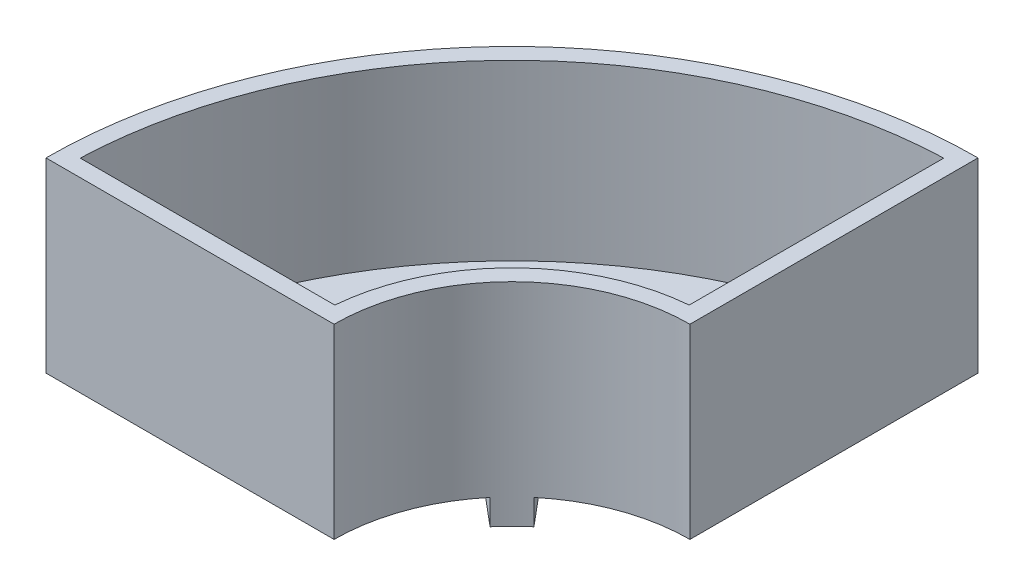
ISO-10303-21;
HEADER;
FILE_DESCRIPTION(('STEP AP214'),'2;1');
FILE_NAME('part.step','',(''),(''),'','','');
FILE_SCHEMA(('AUTOMOTIVE_DESIGN { 1 0 10303 214 1 1 1 1 }'));
ENDSEC;
DATA;
#1=APPLICATION_CONTEXT('core data for automotive mechanical design processes');
#2=APPLICATION_PROTOCOL_DEFINITION('international standard','automotive_design',2000,#1);
#3=PRODUCT_CONTEXT('',#1,'mechanical');
#4=PRODUCT('Part','Part','',(#3));
#5=PRODUCT_RELATED_PRODUCT_CATEGORY('part','',(#4));
#6=PRODUCT_DEFINITION_FORMATION('','',#4);
#7=PRODUCT_DEFINITION_CONTEXT('part definition',#1,'design');
#8=PRODUCT_DEFINITION('design','',#6,#7);
#9=PRODUCT_DEFINITION_SHAPE('','',#8);
#10=(LENGTH_UNIT() NAMED_UNIT(*) SI_UNIT(.MILLI.,.METRE.));
#11=(NAMED_UNIT(*) PLANE_ANGLE_UNIT() SI_UNIT($,.RADIAN.));
#12=(NAMED_UNIT(*) SI_UNIT($,.STERADIAN.) SOLID_ANGLE_UNIT());
#13=UNCERTAINTY_MEASURE_WITH_UNIT(LENGTH_MEASURE(1.E-05),#10,'distance_accuracy_value','');
#14=(GEOMETRIC_REPRESENTATION_CONTEXT(3) GLOBAL_UNCERTAINTY_ASSIGNED_CONTEXT((#13)) GLOBAL_UNIT_ASSIGNED_CONTEXT((#10,
#11,#12)) REPRESENTATION_CONTEXT('',''));
#15=CARTESIAN_POINT('',(0.,0.,0.));
#16=DIRECTION('',(0.,0.,1.));
#17=DIRECTION('',(1.,0.,0.));
#18=AXIS2_PLACEMENT_3D('',#15,#16,#17);
#19=CARTESIAN_POINT('',(0.,0.,0.));
#20=DIRECTION('',(0.,1.,0.));
#21=DIRECTION('',(0.,0.,1.));
#22=AXIS2_PLACEMENT_3D('',#19,#20,#21);
#23=PLANE('',#22);
#24=DIRECTION('',(-0.766044443118979,0.,-0.642787609686538));
#25=VECTOR('',#24,1.);
#26=CARTESIAN_POINT('',(-84.2648887430877,0.,-70.7066370655192));
#27=LINE('',#26,#25);
#28=CARTESIAN_POINT('',(-32.1738666109971,0.,-26.9970796068346));
#29=VERTEX_POINT('',#28);
#30=CARTESIAN_POINT('',(-84.2648887430877,0.,-70.7066370655192));
#31=VERTEX_POINT('',#30);
#32=EDGE_CURVE('E170',#29,#31,#27,.T.);
#33=ORIENTED_EDGE('',*,*,#32,.F.);
#34=CARTESIAN_POINT('',(0.,0.,0.));
#35=DIRECTION('',(0.,-1.,0.));
#36=DIRECTION('',(0.,0.,1.));
#37=AXIS2_PLACEMENT_3D('',#34,#35,#36);
#38=CIRCLE('',#37,42.);
#39=CARTESIAN_POINT('',(-42.,0.,0.));
#40=VERTEX_POINT('',#39);
#41=EDGE_CURVE('E226',#40,#29,#38,.T.);
#42=ORIENTED_EDGE('',*,*,#41,.F.);
#43=DIRECTION('',(1.,0.,0.));
#44=VECTOR('',#43,1.);
#45=CARTESIAN_POINT('',(-110.,0.,0.));
#46=LINE('',#45,#44);
#47=CARTESIAN_POINT('',(-110.,0.,0.));
#48=VERTEX_POINT('',#47);
#49=EDGE_CURVE('E232',#48,#40,#46,.T.);
#50=ORIENTED_EDGE('',*,*,#49,.F.);
#51=CARTESIAN_POINT('',(0.,0.,0.));
#52=DIRECTION('',(0.,1.,0.));
#53=DIRECTION('',(0.,0.,1.));
#54=AXIS2_PLACEMENT_3D('',#51,#52,#53);
#55=CIRCLE('',#54,110.);
#56=EDGE_CURVE('E76',#31,#48,#55,.T.);
#57=ORIENTED_EDGE('',*,*,#56,.F.);
#58=EDGE_LOOP('',(#33,#42,#50,#57));
#59=FACE_BOUND('',#58,.T.);
#60=ADVANCED_FACE('F61',(#59),#23,.F.);
#61=DIRECTION('',(0.642787609686546,0.,0.766044443118973));
#62=VECTOR('',#61,1.);
#63=CARTESIAN_POINT('',(-70.7066370655201,0.,-84.264888743087));
#64=LINE('',#63,#62);
#65=CARTESIAN_POINT('',(-70.7066370655201,0.,-84.264888743087));
#66=VERTEX_POINT('',#65);
#67=CARTESIAN_POINT('',(-26.9970796068349,0.,-32.1738666109969));
#68=VERTEX_POINT('',#67);
#69=EDGE_CURVE('E84',#66,#68,#64,.T.);
#70=ORIENTED_EDGE('',*,*,#69,.F.);
#71=CARTESIAN_POINT('',(0.,0.,-110.));
#72=VERTEX_POINT('',#71);
#73=EDGE_CURVE('E174',#72,#66,#55,.T.);
#74=ORIENTED_EDGE('',*,*,#73,.F.);
#75=DIRECTION('',(0.,0.,-1.));
#76=VECTOR('',#75,1.);
#77=CARTESIAN_POINT('',(0.,0.,-42.));
#78=LINE('',#77,#76);
#79=CARTESIAN_POINT('',(0.,0.,-42.));
#80=VERTEX_POINT('',#79);
#81=EDGE_CURVE('E229',#80,#72,#78,.T.);
#82=ORIENTED_EDGE('',*,*,#81,.F.);
#83=EDGE_CURVE('E225',#68,#80,#38,.T.);
#84=ORIENTED_EDGE('',*,*,#83,.F.);
#85=EDGE_LOOP('',(#70,#74,#82,#84));
#86=FACE_BOUND('',#85,.T.);
#87=ADVANCED_FACE('F243',(#86),#23,.F.);
#88=CARTESIAN_POINT('',(0.,3.,0.));
#89=DIRECTION('',(0.,-1.,0.));
#90=DIRECTION('',(0.,0.,-1.));
#91=AXIS2_PLACEMENT_3D('',#88,#89,#90);
#92=CYLINDRICAL_SURFACE('',#91,42.);
#93=ORIENTED_EDGE('',*,*,#41,.T.);
#94=DIRECTION('',(0.,1.,0.));
#95=VECTOR('',#94,1.);
#96=CARTESIAN_POINT('',(-32.1738666109971,-6.,-26.9970796068346));
#97=LINE('',#96,#95);
#98=CARTESIAN_POINT('',(-32.1738666109971,-6.,-26.9970796068346));
#99=VERTEX_POINT('',#98);
#100=EDGE_CURVE('E179',#99,#29,#97,.T.);
#101=ORIENTED_EDGE('',*,*,#100,.F.);
#102=CARTESIAN_POINT('',(0.,-6.,0.));
#103=DIRECTION('',(0.,1.,0.));
#104=DIRECTION('',(0.,0.,-1.));
#105=AXIS2_PLACEMENT_3D('',#102,#103,#104);
#106=CIRCLE('',#105,42.);
#107=CARTESIAN_POINT('',(-26.9970796068349,-6.,-32.1738666109969));
#108=VERTEX_POINT('',#107);
#109=EDGE_CURVE('E160',#108,#99,#106,.T.);
#110=ORIENTED_EDGE('',*,*,#109,.F.);
#111=DIRECTION('',(0.,1.,0.));
#112=VECTOR('',#111,1.);
#113=CARTESIAN_POINT('',(-26.9970796068349,-6.,-32.1738666109969));
#114=LINE('',#113,#112);
#115=EDGE_CURVE('E157',#108,#68,#114,.T.);
#116=ORIENTED_EDGE('',*,*,#115,.T.);
#117=ORIENTED_EDGE('',*,*,#83,.T.);
#118=DIRECTION('',(0.,-1.,0.));
#119=VECTOR('',#118,1.);
#120=CARTESIAN_POINT('',(0.,3.,-42.));
#121=LINE('',#120,#119);
#122=CARTESIAN_POINT('',(0.,44.,-42.));
#123=VERTEX_POINT('',#122);
#124=EDGE_CURVE('E12',#123,#80,#121,.T.);
#125=ORIENTED_EDGE('',*,*,#124,.F.);
#126=CARTESIAN_POINT('',(0.,44.,0.));
#127=DIRECTION('',(0.,-1.,0.));
#128=DIRECTION('',(0.,0.,1.));
#129=AXIS2_PLACEMENT_3D('',#126,#127,#128);
#130=CIRCLE('',#129,42.);
#131=CARTESIAN_POINT('',(-42.,44.,0.));
#132=VERTEX_POINT('',#131);
#133=EDGE_CURVE('E201',#132,#123,#130,.T.);
#134=ORIENTED_EDGE('',*,*,#133,.F.);
#135=DIRECTION('',(0.,-1.,0.));
#136=VECTOR('',#135,1.);
#137=CARTESIAN_POINT('',(-42.,3.,0.));
#138=LINE('',#137,#136);
#139=EDGE_CURVE('E234',#132,#40,#138,.T.);
#140=ORIENTED_EDGE('',*,*,#139,.T.);
#141=EDGE_LOOP('',(#93,#101,#110,#116,#117,#125,#134,#140));
#142=FACE_BOUND('',#141,.T.);
#143=ADVANCED_FACE('F63',(#142),#92,.F.);
#144=CARTESIAN_POINT('',(0.,3.,-42.));
#145=DIRECTION('',(-1.,0.,0.));
#146=DIRECTION('',(0.,0.,1.));
#147=AXIS2_PLACEMENT_3D('',#144,#145,#146);
#148=PLANE('',#147);
#149=ORIENTED_EDGE('',*,*,#81,.T.);
#150=DIRECTION('',(0.,-1.,0.));
#151=VECTOR('',#150,1.);
#152=CARTESIAN_POINT('',(0.,3.,-110.));
#153=LINE('',#152,#151);
#154=CARTESIAN_POINT('',(0.,44.,-110.));
#155=VERTEX_POINT('',#154);
#156=EDGE_CURVE('E69',#155,#72,#153,.T.);
#157=ORIENTED_EDGE('',*,*,#156,.F.);
#158=DIRECTION('',(0.,0.,-1.));
#159=VECTOR('',#158,1.);
#160=CARTESIAN_POINT('',(0.,44.,-42.));
#161=LINE('',#160,#159);
#162=EDGE_CURVE('E204',#123,#155,#161,.T.);
#163=ORIENTED_EDGE('',*,*,#162,.F.);
#164=ORIENTED_EDGE('',*,*,#124,.T.);
#165=EDGE_LOOP('',(#149,#157,#163,#164));
#166=FACE_BOUND('',#165,.T.);
#167=ADVANCED_FACE('F244',(#166),#148,.F.);
#168=CARTESIAN_POINT('',(0.,3.,0.));
#169=DIRECTION('',(0.,-1.,0.));
#170=DIRECTION('',(0.,0.,-1.));
#171=AXIS2_PLACEMENT_3D('',#168,#169,#170);
#172=CYLINDRICAL_SURFACE('',#171,110.);
#173=ORIENTED_EDGE('',*,*,#73,.T.);
#174=DIRECTION('',(0.,1.,0.));
#175=VECTOR('',#174,1.);
#176=CARTESIAN_POINT('',(-70.7066370655201,-6.,-84.264888743087));
#177=LINE('',#176,#175);
#178=CARTESIAN_POINT('',(-70.7066370655201,-6.,-84.264888743087));
#179=VERTEX_POINT('',#178);
#180=EDGE_CURVE('E155',#179,#66,#177,.T.);
#181=ORIENTED_EDGE('',*,*,#180,.F.);
#182=CARTESIAN_POINT('',(0.,-6.,0.));
#183=DIRECTION('',(0.,-1.,0.));
#184=DIRECTION('',(0.,0.,-1.));
#185=AXIS2_PLACEMENT_3D('',#182,#183,#184);
#186=CIRCLE('',#185,110.);
#187=CARTESIAN_POINT('',(-84.2648887430877,-6.,-70.7066370655192));
#188=VERTEX_POINT('',#187);
#189=EDGE_CURVE('E161',#188,#179,#186,.T.);
#190=ORIENTED_EDGE('',*,*,#189,.F.);
#191=DIRECTION('',(0.,1.,0.));
#192=VECTOR('',#191,1.);
#193=CARTESIAN_POINT('',(-84.2648887430877,-6.,-70.7066370655192));
#194=LINE('',#193,#192);
#195=EDGE_CURVE('E250',#188,#31,#194,.T.);
#196=ORIENTED_EDGE('',*,*,#195,.T.);
#197=ORIENTED_EDGE('',*,*,#56,.T.);
#198=DIRECTION('',(0.,-1.,0.));
#199=VECTOR('',#198,1.);
#200=CARTESIAN_POINT('',(-110.,3.,0.));
#201=LINE('',#200,#199);
#202=CARTESIAN_POINT('',(-110.,44.,0.));
#203=VERTEX_POINT('',#202);
#204=EDGE_CURVE('E237',#203,#48,#201,.T.);
#205=ORIENTED_EDGE('',*,*,#204,.F.);
#206=CARTESIAN_POINT('',(0.,44.,0.));
#207=DIRECTION('',(0.,1.,0.));
#208=DIRECTION('',(0.,0.,1.));
#209=AXIS2_PLACEMENT_3D('',#206,#207,#208);
#210=CIRCLE('',#209,110.);
#211=EDGE_CURVE('E207',#155,#203,#210,.T.);
#212=ORIENTED_EDGE('',*,*,#211,.F.);
#213=ORIENTED_EDGE('',*,*,#156,.T.);
#214=EDGE_LOOP('',(#173,#181,#190,#196,#197,#205,#212,#213));
#215=FACE_BOUND('',#214,.T.);
#216=ADVANCED_FACE('F172',(#215),#172,.T.);
#217=CARTESIAN_POINT('',(-110.,3.,0.));
#218=DIRECTION('',(0.,0.,-1.));
#219=DIRECTION('',(-1.,0.,0.));
#220=AXIS2_PLACEMENT_3D('',#217,#218,#219);
#221=PLANE('',#220);
#222=ORIENTED_EDGE('',*,*,#49,.T.);
#223=ORIENTED_EDGE('',*,*,#139,.F.);
#224=DIRECTION('',(1.,0.,0.));
#225=VECTOR('',#224,1.);
#226=CARTESIAN_POINT('',(-110.,44.,0.));
#227=LINE('',#226,#225);
#228=EDGE_CURVE('E210',#203,#132,#227,.T.);
#229=ORIENTED_EDGE('',*,*,#228,.F.);
#230=ORIENTED_EDGE('',*,*,#204,.T.);
#231=EDGE_LOOP('',(#222,#223,#229,#230));
#232=FACE_BOUND('',#231,.T.);
#233=ADVANCED_FACE('F259',(#232),#221,.F.);
#234=CARTESIAN_POINT('',(0.,44.,0.));
#235=DIRECTION('',(0.,-1.,0.));
#236=DIRECTION('',(0.,0.,-1.));
#237=AXIS2_PLACEMENT_3D('',#234,#235,#236);
#238=PLANE('',#237);
#239=ORIENTED_EDGE('',*,*,#133,.T.);
#240=ORIENTED_EDGE('',*,*,#162,.T.);
#241=ORIENTED_EDGE('',*,*,#211,.T.);
#242=ORIENTED_EDGE('',*,*,#228,.T.);
#243=EDGE_LOOP('',(#239,#240,#241,#242));
#244=FACE_BOUND('',#243,.T.);
#245=CARTESIAN_POINT('',(0.,44.,0.));
#246=DIRECTION('',(0.,1.,0.));
#247=DIRECTION('',(1.,0.,0.));
#248=AXIS2_PLACEMENT_3D('',#245,#246,#247);
#249=CIRCLE('',#248,46.);
#250=CARTESIAN_POINT('',(-45.8257569495584,44.,-4.));
#251=VERTEX_POINT('',#250);
#252=CARTESIAN_POINT('',(-4.,44.,-45.8257569495584));
#253=VERTEX_POINT('',#252);
#254=EDGE_CURVE('E175',#251,#253,#249,.F.);
#255=ORIENTED_EDGE('',*,*,#254,.F.);
#256=DIRECTION('',(1.,0.,0.));
#257=VECTOR('',#256,1.);
#258=CARTESIAN_POINT('',(-110.,44.,-3.99999999999999));
#259=LINE('',#258,#257);
#260=CARTESIAN_POINT('',(-105.924501414923,44.,-3.99999999999999));
#261=VERTEX_POINT('',#260);
#262=EDGE_CURVE('E187',#261,#251,#259,.T.);
#263=ORIENTED_EDGE('',*,*,#262,.F.);
#264=CARTESIAN_POINT('',(0.,44.,0.));
#265=DIRECTION('',(0.,1.,0.));
#266=DIRECTION('',(1.,0.,0.));
#267=AXIS2_PLACEMENT_3D('',#264,#265,#266);
#268=CIRCLE('',#267,106.);
#269=CARTESIAN_POINT('',(-4.,44.,-105.924501414923));
#270=VERTEX_POINT('',#269);
#271=EDGE_CURVE('E184',#270,#261,#268,.T.);
#272=ORIENTED_EDGE('',*,*,#271,.F.);
#273=DIRECTION('',(0.,0.,-1.));
#274=VECTOR('',#273,1.);
#275=CARTESIAN_POINT('',(-4.,44.,-42.));
#276=LINE('',#275,#274);
#277=EDGE_CURVE('E177',#253,#270,#276,.T.);
#278=ORIENTED_EDGE('',*,*,#277,.F.);
#279=EDGE_LOOP('',(#255,#263,#272,#278));
#280=FACE_BOUND('',#279,.T.);
#281=ADVANCED_FACE('F262',(#244,#280),#238,.F.);
#282=CARTESIAN_POINT('',(0.,44.,0.));
#283=DIRECTION('',(0.,-1.,0.));
#284=DIRECTION('',(0.,0.,-1.));
#285=AXIS2_PLACEMENT_3D('',#282,#283,#284);
#286=CYLINDRICAL_SURFACE('',#285,46.);
#287=DIRECTION('',(0.,-1.,0.));
#288=VECTOR('',#287,1.);
#289=CARTESIAN_POINT('',(-4.,44.,-45.8257569495584));
#290=LINE('',#289,#288);
#291=CARTESIAN_POINT('',(-4.,3.,-45.8257569495584));
#292=VERTEX_POINT('',#291);
#293=EDGE_CURVE('E198',#253,#292,#290,.T.);
#294=ORIENTED_EDGE('',*,*,#293,.T.);
#295=CARTESIAN_POINT('',(0.,3.,0.));
#296=DIRECTION('',(0.,1.,0.));
#297=DIRECTION('',(0.,0.,1.));
#298=AXIS2_PLACEMENT_3D('',#295,#296,#297);
#299=CIRCLE('',#298,46.);
#300=CARTESIAN_POINT('',(-45.8257569495584,3.,-4.));
#301=VERTEX_POINT('',#300);
#302=EDGE_CURVE('E222',#292,#301,#299,.T.);
#303=ORIENTED_EDGE('',*,*,#302,.T.);
#304=DIRECTION('',(0.,-1.,0.));
#305=VECTOR('',#304,1.);
#306=CARTESIAN_POINT('',(-45.8257569495584,44.,-4.));
#307=LINE('',#306,#305);
#308=EDGE_CURVE('E189',#251,#301,#307,.T.);
#309=ORIENTED_EDGE('',*,*,#308,.F.);
#310=ORIENTED_EDGE('',*,*,#254,.T.);
#311=EDGE_LOOP('',(#294,#303,#309,#310));
#312=FACE_BOUND('',#311,.T.);
#313=ADVANCED_FACE('F265',(#312),#286,.T.);
#314=CARTESIAN_POINT('',(-4.,44.,-42.));
#315=DIRECTION('',(-1.,0.,0.));
#316=DIRECTION('',(0.,0.,1.));
#317=AXIS2_PLACEMENT_3D('',#314,#315,#316);
#318=PLANE('',#317);
#319=DIRECTION('',(0.,-1.,0.));
#320=VECTOR('',#319,1.);
#321=CARTESIAN_POINT('',(-4.,44.,-105.924501414923));
#322=LINE('',#321,#320);
#323=CARTESIAN_POINT('',(-4.,3.,-105.924501414923));
#324=VERTEX_POINT('',#323);
#325=EDGE_CURVE('E195',#270,#324,#322,.T.);
#326=ORIENTED_EDGE('',*,*,#325,.T.);
#327=DIRECTION('',(0.,0.,1.));
#328=VECTOR('',#327,1.);
#329=CARTESIAN_POINT('',(-4.,3.,0.));
#330=LINE('',#329,#328);
#331=EDGE_CURVE('E219',#324,#292,#330,.T.);
#332=ORIENTED_EDGE('',*,*,#331,.T.);
#333=ORIENTED_EDGE('',*,*,#293,.F.);
#334=ORIENTED_EDGE('',*,*,#277,.T.);
#335=EDGE_LOOP('',(#326,#332,#333,#334));
#336=FACE_BOUND('',#335,.T.);
#337=ADVANCED_FACE('F275',(#336),#318,.T.);
#338=CARTESIAN_POINT('',(0.,44.,0.));
#339=DIRECTION('',(0.,-1.,0.));
#340=DIRECTION('',(0.,0.,-1.));
#341=AXIS2_PLACEMENT_3D('',#338,#339,#340);
#342=CYLINDRICAL_SURFACE('',#341,106.);
#343=DIRECTION('',(0.,-1.,0.));
#344=VECTOR('',#343,1.);
#345=CARTESIAN_POINT('',(-105.924501414923,44.,-3.99999999999999));
#346=LINE('',#345,#344);
#347=CARTESIAN_POINT('',(-105.924501414923,3.,-3.99999999999999));
#348=VERTEX_POINT('',#347);
#349=EDGE_CURVE('E192',#261,#348,#346,.T.);
#350=ORIENTED_EDGE('',*,*,#349,.T.);
#351=CARTESIAN_POINT('',(0.,3.,0.));
#352=DIRECTION('',(0.,1.,0.));
#353=DIRECTION('',(0.,0.,1.));
#354=AXIS2_PLACEMENT_3D('',#351,#352,#353);
#355=CIRCLE('',#354,106.);
#356=EDGE_CURVE('E216',#348,#324,#355,.F.);
#357=ORIENTED_EDGE('',*,*,#356,.T.);
#358=ORIENTED_EDGE('',*,*,#325,.F.);
#359=ORIENTED_EDGE('',*,*,#271,.T.);
#360=EDGE_LOOP('',(#350,#357,#358,#359));
#361=FACE_BOUND('',#360,.T.);
#362=ADVANCED_FACE('F280',(#361),#342,.F.);
#363=CARTESIAN_POINT('',(-110.,44.,-3.99999999999999));
#364=DIRECTION('',(0.,0.,-1.));
#365=DIRECTION('',(-1.,0.,0.));
#366=AXIS2_PLACEMENT_3D('',#363,#364,#365);
#367=PLANE('',#366);
#368=ORIENTED_EDGE('',*,*,#308,.T.);
#369=DIRECTION('',(-1.,0.,0.));
#370=VECTOR('',#369,1.);
#371=CARTESIAN_POINT('',(0.,3.,-4.00000000000001));
#372=LINE('',#371,#370);
#373=EDGE_CURVE('E213',#301,#348,#372,.T.);
#374=ORIENTED_EDGE('',*,*,#373,.T.);
#375=ORIENTED_EDGE('',*,*,#349,.F.);
#376=ORIENTED_EDGE('',*,*,#262,.T.);
#377=EDGE_LOOP('',(#368,#374,#375,#376));
#378=FACE_BOUND('',#377,.T.);
#379=ADVANCED_FACE('F282',(#378),#367,.T.);
#380=CARTESIAN_POINT('',(0.,3.,0.));
#381=DIRECTION('',(0.,1.,0.));
#382=DIRECTION('',(0.,0.,1.));
#383=AXIS2_PLACEMENT_3D('',#380,#381,#382);
#384=PLANE('',#383);
#385=ORIENTED_EDGE('',*,*,#302,.F.);
#386=ORIENTED_EDGE('',*,*,#331,.F.);
#387=ORIENTED_EDGE('',*,*,#356,.F.);
#388=ORIENTED_EDGE('',*,*,#373,.F.);
#389=EDGE_LOOP('',(#385,#386,#387,#388));
#390=FACE_BOUND('',#389,.T.);
#391=ADVANCED_FACE('F278',(#390),#384,.T.);
#392=CARTESIAN_POINT('',(-70.7066370655201,-6.,-84.264888743087));
#393=DIRECTION('',(-0.766044443118972,0.,0.642787609686546));
#394=DIRECTION('',(0.642787609686546,0.,0.766044443118972));
#395=AXIS2_PLACEMENT_3D('',#392,#393,#394);
#396=PLANE('',#395);
#397=ORIENTED_EDGE('',*,*,#69,.T.);
#398=ORIENTED_EDGE('',*,*,#115,.F.);
#399=DIRECTION('',(0.642787609686546,0.,0.766044443118973));
#400=VECTOR('',#399,1.);
#401=CARTESIAN_POINT('',(-70.7066370655201,-6.,-84.264888743087));
#402=LINE('',#401,#400);
#403=EDGE_CURVE('E151',#179,#108,#402,.T.);
#404=ORIENTED_EDGE('',*,*,#403,.F.);
#405=ORIENTED_EDGE('',*,*,#180,.T.);
#406=EDGE_LOOP('',(#397,#398,#404,#405));
#407=FACE_BOUND('',#406,.T.);
#408=ADVANCED_FACE('F153',(#407),#396,.F.);
#409=CARTESIAN_POINT('',(-84.2648887430877,-6.,-70.7066370655192));
#410=DIRECTION('',(0.642787609686538,0.,-0.766044443118979));
#411=DIRECTION('',(-0.766044443118979,0.,-0.642787609686538));
#412=AXIS2_PLACEMENT_3D('',#409,#410,#411);
#413=PLANE('',#412);
#414=ORIENTED_EDGE('',*,*,#32,.T.);
#415=ORIENTED_EDGE('',*,*,#195,.F.);
#416=DIRECTION('',(-0.766044443118979,0.,-0.642787609686538));
#417=VECTOR('',#416,1.);
#418=CARTESIAN_POINT('',(-84.2648887430877,-6.,-70.7066370655192));
#419=LINE('',#418,#417);
#420=EDGE_CURVE('E166',#99,#188,#419,.T.);
#421=ORIENTED_EDGE('',*,*,#420,.F.);
#422=ORIENTED_EDGE('',*,*,#100,.T.);
#423=EDGE_LOOP('',(#414,#415,#421,#422));
#424=FACE_BOUND('',#423,.T.);
#425=ADVANCED_FACE('F256',(#424),#413,.F.);
#426=CARTESIAN_POINT('',(0.,-6.,0.));
#427=DIRECTION('',(0.,-1.,0.));
#428=DIRECTION('',(0.,0.,-1.));
#429=AXIS2_PLACEMENT_3D('',#426,#427,#428);
#430=PLANE('',#429);
#431=ORIENTED_EDGE('',*,*,#189,.T.);
#432=ORIENTED_EDGE('',*,*,#403,.T.);
#433=ORIENTED_EDGE('',*,*,#109,.T.);
#434=ORIENTED_EDGE('',*,*,#420,.T.);
#435=EDGE_LOOP('',(#431,#432,#433,#434));
#436=FACE_BOUND('',#435,.T.);
#437=ADVANCED_FACE('F164',(#436),#430,.T.);
#438=CLOSED_SHELL('',(#60,#87,#143,#167,#216,#233,#281,#313,#337,#362,#379,#391,#408,#425,#437));
#439=MANIFOLD_SOLID_BREP('B2',#438);
#440=ADVANCED_BREP_SHAPE_REPRESENTATION('',(#18,#439),#14);
#441=SHAPE_DEFINITION_REPRESENTATION(#9,#440);
ENDSEC;
END-ISO-10303-21;
